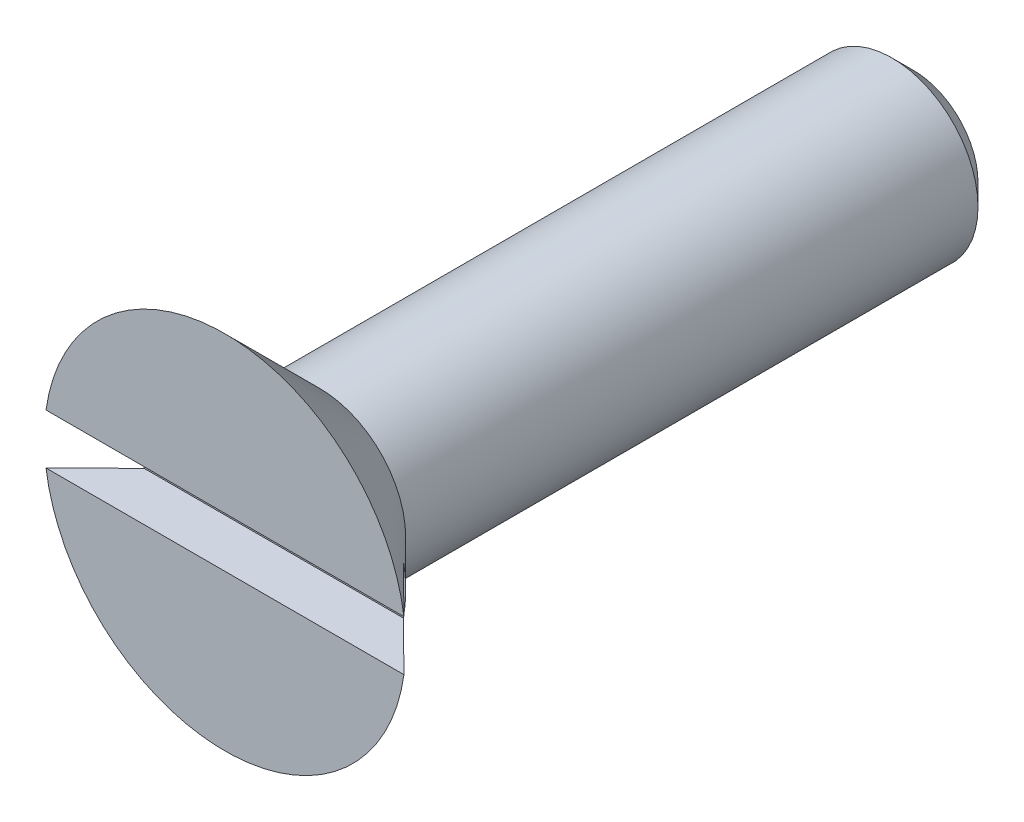
ISO-10303-21;
HEADER;
FILE_DESCRIPTION(('STEP AP214'),'2;1');
FILE_NAME('part.step','',(''),(''),'','','');
FILE_SCHEMA(('AUTOMOTIVE_DESIGN { 1 0 10303 214 1 1 1 1 }'));
ENDSEC;
DATA;
#1=APPLICATION_CONTEXT('core data for automotive mechanical design processes');
#2=APPLICATION_PROTOCOL_DEFINITION('international standard','automotive_design',2000,#1);
#3=PRODUCT_CONTEXT('',#1,'mechanical');
#4=PRODUCT('Part','Part','',(#3));
#5=PRODUCT_RELATED_PRODUCT_CATEGORY('part','',(#4));
#6=PRODUCT_DEFINITION_FORMATION('','',#4);
#7=PRODUCT_DEFINITION_CONTEXT('part definition',#1,'design');
#8=PRODUCT_DEFINITION('design','',#6,#7);
#9=PRODUCT_DEFINITION_SHAPE('','',#8);
#10=(LENGTH_UNIT() NAMED_UNIT(*) SI_UNIT(.MILLI.,.METRE.));
#11=(NAMED_UNIT(*) PLANE_ANGLE_UNIT() SI_UNIT($,.RADIAN.));
#12=(NAMED_UNIT(*) SI_UNIT($,.STERADIAN.) SOLID_ANGLE_UNIT());
#13=UNCERTAINTY_MEASURE_WITH_UNIT(LENGTH_MEASURE(1.E-05),#10,'distance_accuracy_value','');
#14=(GEOMETRIC_REPRESENTATION_CONTEXT(3) GLOBAL_UNCERTAINTY_ASSIGNED_CONTEXT((#13)) GLOBAL_UNIT_ASSIGNED_CONTEXT((#10,
#11,#12)) REPRESENTATION_CONTEXT('',''));
#15=CARTESIAN_POINT('',(0.,0.,0.));
#16=DIRECTION('',(0.,0.,1.));
#17=DIRECTION('',(1.,0.,0.));
#18=AXIS2_PLACEMENT_3D('',#15,#16,#17);
#19=CARTESIAN_POINT('',(0.,0.,1.7));
#20=DIRECTION('',(0.,0.,-1.));
#21=DIRECTION('',(-1.,0.,0.));
#22=AXIS2_PLACEMENT_3D('',#19,#20,#21);
#23=PLANE('',#22);
#24=CARTESIAN_POINT('',(0.,0.,1.7));
#25=DIRECTION('',(0.,0.,1.));
#26=DIRECTION('',(1.,0.,0.));
#27=AXIS2_PLACEMENT_3D('',#24,#25,#26);
#28=CIRCLE('',#27,3.15);
#29=CARTESIAN_POINT('',(-3.11947010724578,-0.4375,1.7));
#30=VERTEX_POINT('',#29);
#31=CARTESIAN_POINT('',(3.11947010724578,-0.4375,1.7));
#32=VERTEX_POINT('',#31);
#33=EDGE_CURVE('E104',#30,#32,#28,.T.);
#34=ORIENTED_EDGE('',*,*,#33,.T.);
#35=DIRECTION('',(1.,0.,0.));
#36=VECTOR('',#35,1.);
#37=CARTESIAN_POINT('',(-3.15,-0.4375,1.7));
#38=LINE('',#37,#36);
#39=EDGE_CURVE('E98',#30,#32,#38,.T.);
#40=ORIENTED_EDGE('',*,*,#39,.F.);
#41=EDGE_LOOP('',(#34,#40));
#42=FACE_BOUND('',#41,.T.);
#43=ADVANCED_FACE('F41',(#42),#23,.F.);
#44=CARTESIAN_POINT('',(3.11947010724578,0.4375,1.7));
#45=VERTEX_POINT('',#44);
#46=CARTESIAN_POINT('',(-3.11947010724578,0.4375,1.7));
#47=VERTEX_POINT('',#46);
#48=EDGE_CURVE('E97',#45,#47,#28,.T.);
#49=ORIENTED_EDGE('',*,*,#48,.T.);
#50=DIRECTION('',(-1.,0.,0.));
#51=VECTOR('',#50,1.);
#52=CARTESIAN_POINT('',(-3.15,0.4375,1.7));
#53=LINE('',#52,#51);
#54=EDGE_CURVE('E89',#45,#47,#53,.T.);
#55=ORIENTED_EDGE('',*,*,#54,.F.);
#56=EDGE_LOOP('',(#49,#55));
#57=FACE_BOUND('',#56,.T.);
#58=ADVANCED_FACE('F43',(#57),#23,.F.);
#59=CARTESIAN_POINT('',(0.,0.,0.0500000000000079));
#60=DIRECTION('',(0.,0.,1.));
#61=DIRECTION('',(1.,0.,0.));
#62=AXIS2_PLACEMENT_3D('',#59,#60,#61);
#63=CONICAL_SURFACE('',#62,1.5,0.785398163397451);
#64=ORIENTED_EDGE('',*,*,#33,.F.);
#65=CARTESIAN_POINT('',(-6.95069435097477,-0.4375,5.51444959854491));
#66=CARTESIAN_POINT('',(-6.71545377725601,-0.4375,5.27967721431496));
#67=CARTESIAN_POINT('',(-6.48019303350266,-0.4375,5.04492502441663));
#68=CARTESIAN_POINT('',(-6.00960192345305,-0.4375,4.57548243964187));
#69=CARTESIAN_POINT('',(-5.77427155604116,-0.4375,4.34079204588382));
#70=CARTESIAN_POINT('',(-5.30343158176121,-0.4375,3.87141438717137));
#71=CARTESIAN_POINT('',(-5.06792194077094,-0.4375,3.63672715644325));
#72=CARTESIAN_POINT('',(-4.59677017117157,-0.4375,3.16749350357989));
#73=CARTESIAN_POINT('',(-4.3611280448257,-0.4375,2.93294707917283));
#74=CARTESIAN_POINT('',(-3.87890631331682,-0.4375,2.45341460844365));
#75=CARTESIAN_POINT('',(-3.63231655090313,-0.4375,2.20843877608446));
#76=CARTESIAN_POINT('',(-3.13871112808016,-0.4375,1.71889165526523));
#77=CARTESIAN_POINT('',(-2.89169544725845,-0.4375,1.47432038736061));
#78=CARTESIAN_POINT('',(-2.52054668169718,-0.4375,1.10815678841121));
#79=CARTESIAN_POINT('',(-2.3967412827444,-0.4375,0.986232561251597));
#80=CARTESIAN_POINT('',(-2.14877789483762,-0.4375,0.74273812276414));
#81=CARTESIAN_POINT('',(-2.02461989882203,-0.4375,0.621167918626616));
#82=CARTESIAN_POINT('',(-1.77574261990939,-0.4375,0.378624419174153));
#83=CARTESIAN_POINT('',(-1.65102338979819,-0.4375,0.257651069877583));
#84=CARTESIAN_POINT('',(-1.46312840439675,-0.4375,0.0770435419685614));
#85=CARTESIAN_POINT('',(-1.40036175145822,-0.4375,0.0169840897073071));
#86=CARTESIAN_POINT('',(-1.27442762204848,-0.4375,-0.10271274659936));
#87=CARTESIAN_POINT('',(-1.21126015041921,-0.4375,-0.162350135725008));
#88=CARTESIAN_POINT('',(-1.11382173052775,-0.4375,-0.25339613639642));
#89=CARTESIAN_POINT('',(-1.07976946155462,-0.4375,-0.285038611518478));
#90=CARTESIAN_POINT('',(-1.01143604619376,-0.4375,-0.348076858100941));
#91=CARTESIAN_POINT('',(-0.977154895825766,-0.4375,-0.3794726252503));
#92=CARTESIAN_POINT('',(-0.908445877673763,-0.4375,-0.441798127970912));
#93=CARTESIAN_POINT('',(-0.874019325470927,-0.4375,-0.472729308933459));
#94=CARTESIAN_POINT('',(-0.804767226320551,-0.4375,-0.534138554654185));
#95=CARTESIAN_POINT('',(-0.7699416938768,-0.4375,-0.564616635791555));
#96=CARTESIAN_POINT('',(-0.687524321535922,-0.4375,-0.635446109424893));
#97=CARTESIAN_POINT('',(-0.63970868674946,-0.4375,-0.675541043817061));
#98=CARTESIAN_POINT('',(-0.566556991446948,-0.4375,-0.73432913801779));
#99=CARTESIAN_POINT('',(-0.54182952959947,-0.4375,-0.753777222319424));
#100=CARTESIAN_POINT('',(-0.491822543056473,-0.4375,-0.791947470581388));
#101=CARTESIAN_POINT('',(-0.466543099302396,-0.4375,-0.810669739870932));
#102=CARTESIAN_POINT('',(-0.414775435391958,-0.4375,-0.847417533943371));
#103=CARTESIAN_POINT('',(-0.388273549584466,-0.4375,-0.865423985183118));
#104=CARTESIAN_POINT('',(-0.334192522338339,-0.4375,-0.899859213763832));
#105=CARTESIAN_POINT('',(-0.306611926297403,-0.4375,-0.916285749684858));
#106=CARTESIAN_POINT('',(-0.250452865815358,-0.4375,-0.946436009532494));
#107=CARTESIAN_POINT('',(-0.221892495276722,-0.4375,-0.960192701204188));
#108=CARTESIAN_POINT('',(-0.163218417249906,-0.4375,-0.983807638318881));
#109=CARTESIAN_POINT('',(-0.133110728635988,-0.4375,-0.993679862316532));
#110=CARTESIAN_POINT('',(-0.0880223692180264,-0.4375,-1.00395141312084));
#111=CARTESIAN_POINT('',(-0.073551465305175,-0.4375,-1.00659400426285));
#112=CARTESIAN_POINT('',(-0.0444235926394925,-0.4375,-1.01048860754213));
#113=CARTESIAN_POINT('',(-0.0297666321560671,-0.4375,-1.0117406812645));
#114=CARTESIAN_POINT('',(0.0142250952761395,-0.4375,-1.01323688027924));
#115=CARTESIAN_POINT('',(0.0436649939441677,-0.4375,-1.01124128469903));
#116=CARTESIAN_POINT('',(0.101292142840405,-0.4375,-1.0018327116412));
#117=CARTESIAN_POINT('',(0.129488837077696,-0.4375,-0.994472979526124));
#118=CARTESIAN_POINT('',(0.170809309856394,-0.4375,-0.980519211556384));
#119=CARTESIAN_POINT('',(0.184454897966584,-0.4375,-0.975364865735926));
#120=CARTESIAN_POINT('',(0.211412528671322,-0.4375,-0.96425186784909));
#121=CARTESIAN_POINT('',(0.224724643745628,-0.4375,-0.958293392389047));
#122=CARTESIAN_POINT('',(0.266777045448894,-0.4375,-0.938210779497741));
#123=CARTESIAN_POINT('',(0.294921432003761,-0.4375,-0.922845882651961));
#124=CARTESIAN_POINT('',(0.350046604409141,-0.4375,-0.89013582475984));
#125=CARTESIAN_POINT('',(0.377025762743036,-0.4375,-0.87278800997322));
#126=CARTESIAN_POINT('',(0.430201279890642,-0.4375,-0.83673288612168));
#127=CARTESIAN_POINT('',(0.456394298082687,-0.4375,-0.818020690833663));
#128=CARTESIAN_POINT('',(0.50812313076528,-0.4375,-0.77970481009805));
#129=CARTESIAN_POINT('',(0.533658785434775,-0.4375,-0.760100911001922));
#130=CARTESIAN_POINT('',(0.610057648748741,-0.4375,-0.699952314625999));
#131=CARTESIAN_POINT('',(0.660169188221462,-0.4375,-0.658457053720058));
#132=CARTESIAN_POINT('',(0.759095952529052,-0.4375,-0.574228201210139));
#133=CARTESIAN_POINT('',(0.807914210937513,-0.4375,-0.531498112455194));
#134=CARTESIAN_POINT('',(0.903777928724115,-0.4375,-0.4461297183887));
#135=CARTESIAN_POINT('',(0.950838989272428,-0.4375,-0.403508906492821));
#136=CARTESIAN_POINT('',(1.04448251759101,-0.4375,-0.317745372768809));
#137=CARTESIAN_POINT('',(1.09106497765321,-0.4375,-0.274602642559246));
#138=CARTESIAN_POINT('',(1.23032604080343,-0.4375,-0.144633863624959));
#139=CARTESIAN_POINT('',(1.32250810126808,-0.4375,-0.05727648186134));
#140=CARTESIAN_POINT('',(1.50626750098789,-0.4375,0.118289223323196));
#141=CARTESIAN_POINT('',(1.59784397500925,-0.4375,0.206498447368561));
#142=CARTESIAN_POINT('',(1.78054968777642,-0.4375,0.383368131795782));
#143=CARTESIAN_POINT('',(1.8716789522241,-0.4375,0.47202856563489));
#144=CARTESIAN_POINT('',(2.0527126028453,-0.4375,0.648726833335544));
#145=CARTESIAN_POINT('',(2.14261992922196,-0.4375,0.73676165898462));
#146=CARTESIAN_POINT('',(2.32224140147481,-0.4375,0.913030831048659));
#147=CARTESIAN_POINT('',(2.41195554439885,-0.4375,1.00126518047099));
#148=CARTESIAN_POINT('',(2.68081262073546,-0.4375,1.26610037012193));
#149=CARTESIAN_POINT('',(2.85974916511933,-0.4375,1.44291065018944));
#150=CARTESIAN_POINT('',(3.36306970387667,-0.4375,1.94108895648711));
#151=CARTESIAN_POINT('',(3.68711145552849,-0.4375,2.26280243883242));
#152=CARTESIAN_POINT('',(4.33482479338633,-0.4375,2.90671341989869));
#153=CARTESIAN_POINT('',(4.65849630580628,-0.4375,3.22891099276393));
#154=CARTESIAN_POINT('',(5.31036659154146,-0.4375,3.87827901327936));
#155=CARTESIAN_POINT('',(5.63856193497032,-0.4375,4.20545290383715));
#156=CARTESIAN_POINT('',(6.29474601208318,-0.4375,4.85989136733905));
#157=CARTESIAN_POINT('',(6.6227347721014,-0.4375,5.18715591387629));
#158=CARTESIAN_POINT('',(6.95069435097477,-0.4375,5.51444959854491));
#159=B_SPLINE_CURVE_WITH_KNOTS('',3,(#65,#66,#67,#68,#69,#70,#71,#72,#73,#74,#75,#76,#77,#78,
#79,#80,#81,#82,#83,#84,#85,#86,#87,#88,#89,#90,#91,#92,#93,#94,#95,#96,#97,#98,#99,#100,#101,
#102,#103,#104,#105,#106,#107,#108,#109,#110,#111,#112,#113,#114,#115,#116,#117,#118,#119,#120,
#121,#122,#123,#124,#125,#126,#127,#128,#129,#130,#131,#132,#133,#134,#135,#136,#137,#138,#139,
#140,#141,#142,#143,#144,#145,#146,#147,#148,#149,#150,#151,#152,#153,#154,#155,#156,#157,#158),
.UNSPECIFIED.,.F.,.F.,(4,2,2,2,2,2,2,2,2,2,2,2,2,2,2,2,2,2,2,2,2,2,2,2,2,2,2,2,2,2,2,2,2,2,2,2,
2,2,2,2,2,2,2,2,2,2,4),(0.,0.997048560654659,1.99411407159498,2.9915537582241,3.98897689423789,
5.03175047299187,6.07457549937006,6.59586149567601,7.11715800663534,7.63840647212515,
7.89902218841885,8.15963476241322,8.29908714979861,8.43854196861998,8.5773812160964,
8.71621543238273,8.90338051507032,8.99774881127713,9.09210336123648,9.18818823101548,
9.28440746521176,9.37935012372772,9.473947928805,9.5180182515728,9.56208662241713,
9.64996810467844,9.73698893848584,9.78072959357587,9.82446065774542,9.92051040347212,
10.0166902318302,10.1132332446856,10.2097995119603,10.4049299988875,10.5995527867628,
10.7900231132878,10.9804965026262,11.3614846523295,11.74293313361,12.1243594294601,
12.5018522839031,12.8793508666369,13.634016533687,15.0038781067776,16.3739768056718,
17.7642265085964,19.1542294238138),.UNSPECIFIED.);
#160=CARTESIAN_POINT('',(-2.25800658767861,-0.4375,0.85));
#161=VERTEX_POINT('',#160);
#162=EDGE_CURVE('E11',#30,#161,#159,.T.);
#163=ORIENTED_EDGE('',*,*,#162,.T.);
#164=CARTESIAN_POINT('',(0.,0.,0.85));
#165=DIRECTION('',(0.,0.,1.));
#166=DIRECTION('',(1.,0.,0.));
#167=AXIS2_PLACEMENT_3D('',#164,#165,#166);
#168=CIRCLE('',#167,2.3);
#169=CARTESIAN_POINT('',(-2.25800658767861,0.4375,0.85));
#170=VERTEX_POINT('',#169);
#171=EDGE_CURVE('E107',#170,#161,#168,.T.);
#172=ORIENTED_EDGE('',*,*,#171,.F.);
#173=CARTESIAN_POINT('',(6.95069435097477,0.4375,5.51444959854491));
#174=CARTESIAN_POINT('',(6.71545377725601,0.4375,5.27967721431496));
#175=CARTESIAN_POINT('',(6.48019303350266,0.4375,5.04492502441663));
#176=CARTESIAN_POINT('',(6.00960192345305,0.4375,4.57548243964187));
#177=CARTESIAN_POINT('',(5.77427155604116,0.4375,4.34079204588382));
#178=CARTESIAN_POINT('',(5.30343158176121,0.4375,3.87141438717137));
#179=CARTESIAN_POINT('',(5.06792194077094,0.4375,3.63672715644325));
#180=CARTESIAN_POINT('',(4.59677017117157,0.4375,3.16749350357989));
#181=CARTESIAN_POINT('',(4.3611280448257,0.4375,2.93294707917283));
#182=CARTESIAN_POINT('',(3.87890631331682,0.4375,2.45341460844365));
#183=CARTESIAN_POINT('',(3.63231655090313,0.4375,2.20843877608446));
#184=CARTESIAN_POINT('',(3.13871112808016,0.4375,1.71889165526523));
#185=CARTESIAN_POINT('',(2.89169544725845,0.4375,1.47432038736061));
#186=CARTESIAN_POINT('',(2.52054668169718,0.4375,1.10815678841121));
#187=CARTESIAN_POINT('',(2.3967412827444,0.4375,0.986232561251597));
#188=CARTESIAN_POINT('',(2.14877789483762,0.4375,0.74273812276414));
#189=CARTESIAN_POINT('',(2.02461989882203,0.4375,0.621167918626616));
#190=CARTESIAN_POINT('',(1.77574261990939,0.4375,0.378624419174153));
#191=CARTESIAN_POINT('',(1.65102338979819,0.4375,0.257651069877583));
#192=CARTESIAN_POINT('',(1.46312840439675,0.4375,0.0770435419685614));
#193=CARTESIAN_POINT('',(1.40036175145822,0.4375,0.0169840897073071));
#194=CARTESIAN_POINT('',(1.27442762204848,0.4375,-0.10271274659936));
#195=CARTESIAN_POINT('',(1.21126015041921,0.4375,-0.162350135725008));
#196=CARTESIAN_POINT('',(1.11382173052775,0.4375,-0.25339613639642));
#197=CARTESIAN_POINT('',(1.07976946155462,0.4375,-0.285038611518478));
#198=CARTESIAN_POINT('',(1.01143604619376,0.4375,-0.348076858100941));
#199=CARTESIAN_POINT('',(0.977154895825766,0.4375,-0.3794726252503));
#200=CARTESIAN_POINT('',(0.908445877673763,0.4375,-0.441798127970912));
#201=CARTESIAN_POINT('',(0.874019325470927,0.4375,-0.472729308933459));
#202=CARTESIAN_POINT('',(0.804767226320551,0.4375,-0.534138554654185));
#203=CARTESIAN_POINT('',(0.7699416938768,0.4375,-0.564616635791555));
#204=CARTESIAN_POINT('',(0.687524321535922,0.4375,-0.635446109424893));
#205=CARTESIAN_POINT('',(0.63970868674946,0.4375,-0.675541043817061));
#206=CARTESIAN_POINT('',(0.566556991446948,0.4375,-0.73432913801779));
#207=CARTESIAN_POINT('',(0.54182952959947,0.4375,-0.753777222319424));
#208=CARTESIAN_POINT('',(0.491822543056473,0.4375,-0.791947470581388));
#209=CARTESIAN_POINT('',(0.466543099302396,0.4375,-0.810669739870932));
#210=CARTESIAN_POINT('',(0.414775435391958,0.4375,-0.847417533943371));
#211=CARTESIAN_POINT('',(0.388273549584466,0.4375,-0.865423985183118));
#212=CARTESIAN_POINT('',(0.334192522338339,0.4375,-0.899859213763832));
#213=CARTESIAN_POINT('',(0.306611926297403,0.4375,-0.916285749684858));
#214=CARTESIAN_POINT('',(0.250452865815358,0.4375,-0.946436009532494));
#215=CARTESIAN_POINT('',(0.221892495276722,0.4375,-0.960192701204188));
#216=CARTESIAN_POINT('',(0.163218417249906,0.4375,-0.983807638318881));
#217=CARTESIAN_POINT('',(0.133110728635988,0.4375,-0.993679862316532));
#218=CARTESIAN_POINT('',(0.0880223692180264,0.4375,-1.00395141312084));
#219=CARTESIAN_POINT('',(0.073551465305175,0.4375,-1.00659400426285));
#220=CARTESIAN_POINT('',(0.0444235926394925,0.4375,-1.01048860754213));
#221=CARTESIAN_POINT('',(0.0297666321560671,0.4375,-1.0117406812645));
#222=CARTESIAN_POINT('',(-0.0142250952761395,0.4375,-1.01323688027924));
#223=CARTESIAN_POINT('',(-0.0436649939441677,0.4375,-1.01124128469903));
#224=CARTESIAN_POINT('',(-0.101292142840405,0.4375,-1.0018327116412));
#225=CARTESIAN_POINT('',(-0.129488837077696,0.4375,-0.994472979526124));
#226=CARTESIAN_POINT('',(-0.170809309856394,0.4375,-0.980519211556384));
#227=CARTESIAN_POINT('',(-0.184454897966584,0.4375,-0.975364865735926));
#228=CARTESIAN_POINT('',(-0.211412528671322,0.4375,-0.96425186784909));
#229=CARTESIAN_POINT('',(-0.224724643745628,0.4375,-0.958293392389047));
#230=CARTESIAN_POINT('',(-0.266777045448894,0.4375,-0.938210779497741));
#231=CARTESIAN_POINT('',(-0.294921432003761,0.4375,-0.922845882651961));
#232=CARTESIAN_POINT('',(-0.350046604409141,0.4375,-0.89013582475984));
#233=CARTESIAN_POINT('',(-0.377025762743036,0.4375,-0.87278800997322));
#234=CARTESIAN_POINT('',(-0.430201279890642,0.4375,-0.83673288612168));
#235=CARTESIAN_POINT('',(-0.456394298082687,0.4375,-0.818020690833663));
#236=CARTESIAN_POINT('',(-0.50812313076528,0.4375,-0.77970481009805));
#237=CARTESIAN_POINT('',(-0.533658785434775,0.4375,-0.760100911001922));
#238=CARTESIAN_POINT('',(-0.610057648748741,0.4375,-0.699952314625999));
#239=CARTESIAN_POINT('',(-0.660169188221462,0.4375,-0.658457053720058));
#240=CARTESIAN_POINT('',(-0.759095952529052,0.4375,-0.574228201210139));
#241=CARTESIAN_POINT('',(-0.807914210937513,0.4375,-0.531498112455194));
#242=CARTESIAN_POINT('',(-0.903777928724115,0.4375,-0.4461297183887));
#243=CARTESIAN_POINT('',(-0.950838989272428,0.4375,-0.403508906492821));
#244=CARTESIAN_POINT('',(-1.04448251759101,0.4375,-0.317745372768809));
#245=CARTESIAN_POINT('',(-1.09106497765321,0.4375,-0.274602642559246));
#246=CARTESIAN_POINT('',(-1.23032604080343,0.4375,-0.144633863624959));
#247=CARTESIAN_POINT('',(-1.32250810126808,0.4375,-0.05727648186134));
#248=CARTESIAN_POINT('',(-1.50626750098789,0.4375,0.118289223323196));
#249=CARTESIAN_POINT('',(-1.59784397500925,0.4375,0.206498447368561));
#250=CARTESIAN_POINT('',(-1.78054968777642,0.4375,0.383368131795782));
#251=CARTESIAN_POINT('',(-1.8716789522241,0.4375,0.47202856563489));
#252=CARTESIAN_POINT('',(-2.0527126028453,0.4375,0.648726833335544));
#253=CARTESIAN_POINT('',(-2.14261992922196,0.4375,0.73676165898462));
#254=CARTESIAN_POINT('',(-2.32224140147481,0.4375,0.913030831048659));
#255=CARTESIAN_POINT('',(-2.41195554439885,0.4375,1.00126518047099));
#256=CARTESIAN_POINT('',(-2.68081262073546,0.4375,1.26610037012193));
#257=CARTESIAN_POINT('',(-2.85974916511933,0.4375,1.44291065018944));
#258=CARTESIAN_POINT('',(-3.36306970387667,0.4375,1.94108895648711));
#259=CARTESIAN_POINT('',(-3.68711145552849,0.4375,2.26280243883242));
#260=CARTESIAN_POINT('',(-4.33482479338633,0.4375,2.90671341989869));
#261=CARTESIAN_POINT('',(-4.65849630580628,0.4375,3.22891099276393));
#262=CARTESIAN_POINT('',(-5.31036659154146,0.4375,3.87827901327936));
#263=CARTESIAN_POINT('',(-5.63856193497032,0.4375,4.20545290383715));
#264=CARTESIAN_POINT('',(-6.29474601208318,0.4375,4.85989136733905));
#265=CARTESIAN_POINT('',(-6.6227347721014,0.4375,5.18715591387629));
#266=CARTESIAN_POINT('',(-6.95069435097477,0.4375,5.51444959854491));
#267=B_SPLINE_CURVE_WITH_KNOTS('',3,(#173,#174,#175,#176,#177,#178,#179,#180,#181,#182,#183,
#184,#185,#186,#187,#188,#189,#190,#191,#192,#193,#194,#195,#196,#197,#198,#199,#200,#201,#202,
#203,#204,#205,#206,#207,#208,#209,#210,#211,#212,#213,#214,#215,#216,#217,#218,#219,#220,#221,
#222,#223,#224,#225,#226,#227,#228,#229,#230,#231,#232,#233,#234,#235,#236,#237,#238,#239,#240,
#241,#242,#243,#244,#245,#246,#247,#248,#249,#250,#251,#252,#253,#254,#255,#256,#257,#258,#259,
#260,#261,#262,#263,#264,#265,#266),.UNSPECIFIED.,.F.,.F.,(4,2,2,2,2,2,2,2,2,2,2,2,2,2,2,2,2,2,
2,2,2,2,2,2,2,2,2,2,2,2,2,2,2,2,2,2,2,2,2,2,2,2,2,2,2,2,4),(0.,0.997048560654659,
1.99411407159498,2.9915537582241,3.98897689423789,5.03175047299187,6.07457549937006,
6.59586149567601,7.11715800663534,7.63840647212515,7.89902218841885,8.15963476241322,
8.29908714979861,8.43854196861998,8.5773812160964,8.71621543238273,8.90338051507032,
8.99774881127713,9.09210336123648,9.18818823101548,9.28440746521176,9.37935012372772,
9.473947928805,9.5180182515728,9.56208662241713,9.64996810467844,9.73698893848584,
9.78072959357587,9.82446065774542,9.92051040347212,10.0166902318302,10.1132332446856,
10.2097995119603,10.4049299988875,10.5995527867628,10.7900231132878,10.9804965026262,
11.3614846523295,11.74293313361,12.1243594294601,12.5018522839031,12.8793508666369,
13.634016533687,15.0038781067776,16.3739768056718,17.7642265085964,19.1542294238138),.UNSPECIFIED.);
#268=EDGE_CURVE('E55',#170,#47,#267,.T.);
#269=ORIENTED_EDGE('',*,*,#268,.T.);
#270=ORIENTED_EDGE('',*,*,#48,.F.);
#271=CARTESIAN_POINT('',(2.25800658767861,0.4375,0.85));
#272=VERTEX_POINT('',#271);
#273=EDGE_CURVE('E86',#45,#272,#267,.T.);
#274=ORIENTED_EDGE('',*,*,#273,.T.);
#275=CARTESIAN_POINT('',(2.25800658767861,-0.4375,0.85));
#276=VERTEX_POINT('',#275);
#277=EDGE_CURVE('E94',#276,#272,#168,.T.);
#278=ORIENTED_EDGE('',*,*,#277,.F.);
#279=EDGE_CURVE('E45',#276,#32,#159,.T.);
#280=ORIENTED_EDGE('',*,*,#279,.T.);
#281=EDGE_LOOP('',(#64,#163,#172,#269,#270,#274,#278,#280));
#282=FACE_BOUND('',#281,.T.);
#283=CARTESIAN_POINT('',(0.,0.,0.0500000000000079));
#284=DIRECTION('',(0.,0.,1.));
#285=DIRECTION('',(1.,0.,0.));
#286=AXIS2_PLACEMENT_3D('',#283,#284,#285);
#287=CIRCLE('',#286,1.5);
#288=CARTESIAN_POINT('',(1.5,0.,0.0500000000000079));
#289=VERTEX_POINT('',#288);
#290=EDGE_CURVE('E109',#289,#289,#287,.T.);
#291=ORIENTED_EDGE('',*,*,#290,.T.);
#292=EDGE_LOOP('',(#291));
#293=FACE_BOUND('',#292,.T.);
#294=ADVANCED_FACE('F101',(#282,#293),#63,.T.);
#295=CARTESIAN_POINT('',(0.,0.,1.7));
#296=DIRECTION('',(0.,0.,1.));
#297=DIRECTION('',(1.,0.,0.));
#298=AXIS2_PLACEMENT_3D('',#295,#296,#297);
#299=CYLINDRICAL_SURFACE('',#298,1.5);
#300=ORIENTED_EDGE('',*,*,#290,.F.);
#301=EDGE_LOOP('',(#300));
#302=FACE_BOUND('',#301,.T.);
#303=CARTESIAN_POINT('',(0.,0.,-9.925));
#304=DIRECTION('',(0.,0.,1.));
#305=DIRECTION('',(1.,0.,0.));
#306=AXIS2_PLACEMENT_3D('',#303,#304,#305);
#307=CIRCLE('',#306,1.5);
#308=CARTESIAN_POINT('',(1.5,0.,-9.925));
#309=VERTEX_POINT('',#308);
#310=EDGE_CURVE('E152',#309,#309,#307,.T.);
#311=ORIENTED_EDGE('',*,*,#310,.T.);
#312=EDGE_LOOP('',(#311));
#313=FACE_BOUND('',#312,.T.);
#314=ADVANCED_FACE('F132',(#302,#313),#299,.T.);
#315=CARTESIAN_POINT('',(0.,0.,-10.3));
#316=DIRECTION('',(0.,0.,1.));
#317=DIRECTION('',(1.,0.,0.));
#318=AXIS2_PLACEMENT_3D('',#315,#316,#317);
#319=CONICAL_SURFACE('',#318,1.125,0.785398163397448);
#320=ORIENTED_EDGE('',*,*,#310,.F.);
#321=EDGE_LOOP('',(#320));
#322=FACE_BOUND('',#321,.T.);
#323=CARTESIAN_POINT('',(0.,0.,-10.3));
#324=DIRECTION('',(0.,0.,1.));
#325=DIRECTION('',(1.,0.,0.));
#326=AXIS2_PLACEMENT_3D('',#323,#324,#325);
#327=CIRCLE('',#326,1.125);
#328=CARTESIAN_POINT('',(1.125,0.,-10.3));
#329=VERTEX_POINT('',#328);
#330=EDGE_CURVE('E149',#329,#329,#327,.T.);
#331=ORIENTED_EDGE('',*,*,#330,.T.);
#332=EDGE_LOOP('',(#331));
#333=FACE_BOUND('',#332,.T.);
#334=ADVANCED_FACE('F129',(#322,#333),#319,.T.);
#335=CARTESIAN_POINT('',(0.,1.125,-10.3));
#336=DIRECTION('',(0.,0.,1.));
#337=DIRECTION('',(1.,0.,0.));
#338=AXIS2_PLACEMENT_3D('',#335,#336,#337);
#339=PLANE('',#338);
#340=ORIENTED_EDGE('',*,*,#330,.F.);
#341=EDGE_LOOP('',(#340));
#342=FACE_BOUND('',#341,.T.);
#343=ADVANCED_FACE('F126',(#342),#339,.F.);
#344=CARTESIAN_POINT('',(-3.15,-0.4375,0.85));
#345=DIRECTION('',(0.,-1.,0.));
#346=DIRECTION('',(0.,0.,-1.));
#347=AXIS2_PLACEMENT_3D('',#344,#345,#346);
#348=PLANE('',#347);
#349=ORIENTED_EDGE('',*,*,#39,.T.);
#350=ORIENTED_EDGE('',*,*,#279,.F.);
#351=DIRECTION('',(1.,0.,0.));
#352=VECTOR('',#351,1.);
#353=CARTESIAN_POINT('',(-3.15,-0.4375,0.85));
#354=LINE('',#353,#352);
#355=EDGE_CURVE('E62',#161,#276,#354,.T.);
#356=ORIENTED_EDGE('',*,*,#355,.F.);
#357=ORIENTED_EDGE('',*,*,#162,.F.);
#358=EDGE_LOOP('',(#349,#350,#356,#357));
#359=FACE_BOUND('',#358,.T.);
#360=ADVANCED_FACE('F123',(#359),#348,.F.);
#361=CARTESIAN_POINT('',(-3.15,0.4375,0.85));
#362=DIRECTION('',(0.,1.,0.));
#363=DIRECTION('',(0.,0.,1.));
#364=AXIS2_PLACEMENT_3D('',#361,#362,#363);
#365=PLANE('',#364);
#366=ORIENTED_EDGE('',*,*,#54,.T.);
#367=ORIENTED_EDGE('',*,*,#268,.F.);
#368=DIRECTION('',(-1.,0.,0.));
#369=VECTOR('',#368,1.);
#370=CARTESIAN_POINT('',(-3.15,0.4375,0.85));
#371=LINE('',#370,#369);
#372=EDGE_CURVE('E90',#272,#170,#371,.T.);
#373=ORIENTED_EDGE('',*,*,#372,.F.);
#374=ORIENTED_EDGE('',*,*,#273,.F.);
#375=EDGE_LOOP('',(#366,#367,#373,#374));
#376=FACE_BOUND('',#375,.T.);
#377=ADVANCED_FACE('F88',(#376),#365,.F.);
#378=CARTESIAN_POINT('',(0.,0.,0.85));
#379=DIRECTION('',(0.,0.,1.));
#380=DIRECTION('',(1.,0.,0.));
#381=AXIS2_PLACEMENT_3D('',#378,#379,#380);
#382=PLANE('',#381);
#383=ORIENTED_EDGE('',*,*,#171,.T.);
#384=ORIENTED_EDGE('',*,*,#355,.T.);
#385=ORIENTED_EDGE('',*,*,#277,.T.);
#386=ORIENTED_EDGE('',*,*,#372,.T.);
#387=EDGE_LOOP('',(#383,#384,#385,#386));
#388=FACE_BOUND('',#387,.T.);
#389=ADVANCED_FACE('F122',(#388),#382,.T.);
#390=CLOSED_SHELL('',(#43,#58,#294,#314,#334,#343,#360,#377,#389));
#391=MANIFOLD_SOLID_BREP('B2',#390);
#392=ADVANCED_BREP_SHAPE_REPRESENTATION('',(#18,#391),#14);
#393=SHAPE_DEFINITION_REPRESENTATION(#9,#392);
ENDSEC;
END-ISO-10303-21;
